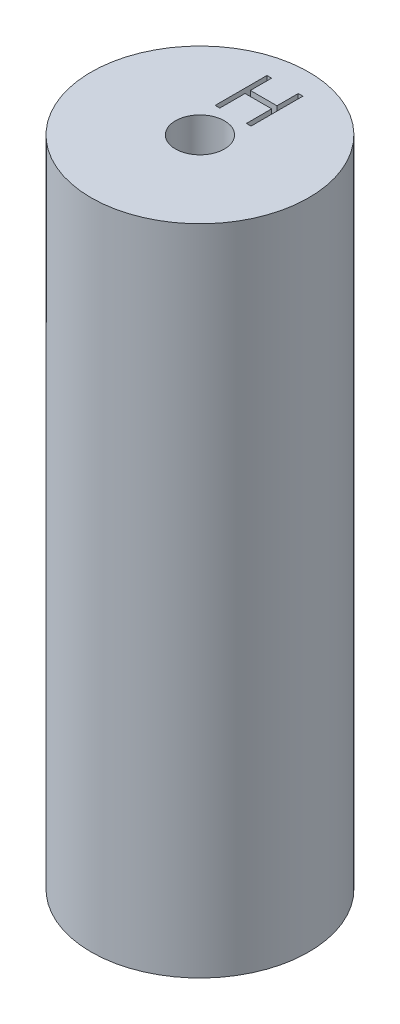
ISO-10303-21;
HEADER;
FILE_DESCRIPTION(('STEP AP214'),'2;1');
FILE_NAME('part.step','',(''),(''),'','','');
FILE_SCHEMA(('AUTOMOTIVE_DESIGN { 1 0 10303 214 1 1 1 1 }'));
ENDSEC;
DATA;
#1=APPLICATION_CONTEXT('core data for automotive mechanical design processes');
#2=APPLICATION_PROTOCOL_DEFINITION('international standard','automotive_design',2000,#1);
#3=PRODUCT_CONTEXT('',#1,'mechanical');
#4=PRODUCT('Part','Part','',(#3));
#5=PRODUCT_RELATED_PRODUCT_CATEGORY('part','',(#4));
#6=PRODUCT_DEFINITION_FORMATION('','',#4);
#7=PRODUCT_DEFINITION_CONTEXT('part definition',#1,'design');
#8=PRODUCT_DEFINITION('design','',#6,#7);
#9=PRODUCT_DEFINITION_SHAPE('','',#8);
#10=(LENGTH_UNIT() NAMED_UNIT(*) SI_UNIT(.MILLI.,.METRE.));
#11=(NAMED_UNIT(*) PLANE_ANGLE_UNIT() SI_UNIT($,.RADIAN.));
#12=(NAMED_UNIT(*) SI_UNIT($,.STERADIAN.) SOLID_ANGLE_UNIT());
#13=UNCERTAINTY_MEASURE_WITH_UNIT(LENGTH_MEASURE(1.E-05),#10,'distance_accuracy_value','');
#14=(GEOMETRIC_REPRESENTATION_CONTEXT(3) GLOBAL_UNCERTAINTY_ASSIGNED_CONTEXT((#13)) GLOBAL_UNIT_ASSIGNED_CONTEXT((#10,
#11,#12)) REPRESENTATION_CONTEXT('',''));
#15=CARTESIAN_POINT('',(0.,0.,0.));
#16=DIRECTION('',(0.,0.,1.));
#17=DIRECTION('',(1.,0.,0.));
#18=AXIS2_PLACEMENT_3D('',#15,#16,#17);
#19=CARTESIAN_POINT('',(0.,60.,0.));
#20=DIRECTION('',(0.,1.,0.));
#21=DIRECTION('',(0.,0.,1.));
#22=AXIS2_PLACEMENT_3D('',#19,#20,#21);
#23=PLANE('',#22);
#24=CARTESIAN_POINT('',(0.,60.,0.));
#25=DIRECTION('',(0.,1.,0.));
#26=DIRECTION('',(0.,0.,1.));
#27=AXIS2_PLACEMENT_3D('',#24,#25,#26);
#28=CIRCLE('',#27,2.25);
#29=CARTESIAN_POINT('',(0.,60.,2.25));
#30=VERTEX_POINT('',#29);
#31=EDGE_CURVE('E354',#30,#30,#28,.T.);
#32=ORIENTED_EDGE('',*,*,#31,.F.);
#33=EDGE_LOOP('',(#32));
#34=FACE_BOUND('',#33,.T.);
#35=CARTESIAN_POINT('',(0.,60.,0.));
#36=DIRECTION('',(0.,1.,0.));
#37=DIRECTION('',(0.,0.,1.));
#38=AXIS2_PLACEMENT_3D('',#35,#36,#37);
#39=CIRCLE('',#38,10.);
#40=CARTESIAN_POINT('',(0.,60.,10.));
#41=VERTEX_POINT('',#40);
#42=EDGE_CURVE('E251',#41,#41,#39,.T.);
#43=ORIENTED_EDGE('',*,*,#42,.T.);
#44=EDGE_LOOP('',(#43));
#45=FACE_BOUND('',#44,.T.);
#46=DIRECTION('',(-1.,0.,0.));
#47=VECTOR('',#46,1.);
#48=CARTESIAN_POINT('',(-1.22115384615385,60.,-3.04447224017773));
#49=LINE('',#48,#47);
#50=CARTESIAN_POINT('',(-1.22115384615385,60.,-3.04447224017773));
#51=VERTEX_POINT('',#50);
#52=CARTESIAN_POINT('',(-1.64855769230769,60.,-3.04447224017773));
#53=VERTEX_POINT('',#52);
#54=EDGE_CURVE('E216',#51,#53,#49,.T.);
#55=ORIENTED_EDGE('',*,*,#54,.T.);
#56=DIRECTION('',(0.,0.,-1.));
#57=VECTOR('',#56,1.);
#58=CARTESIAN_POINT('',(-1.64855769230769,60.,-3.04447224017773));
#59=LINE('',#58,#57);
#60=CARTESIAN_POINT('',(-1.64855769230769,60.,-7.80697224017773));
#61=VERTEX_POINT('',#60);
#62=EDGE_CURVE('E65',#53,#61,#59,.T.);
#63=ORIENTED_EDGE('',*,*,#62,.T.);
#64=DIRECTION('',(1.,0.,0.));
#65=VECTOR('',#64,1.);
#66=CARTESIAN_POINT('',(-1.64855769230769,60.,-7.80697224017773));
#67=LINE('',#66,#65);
#68=CARTESIAN_POINT('',(-1.22115384615385,60.,-7.80697224017773));
#69=VERTEX_POINT('',#68);
#70=EDGE_CURVE('E178',#61,#69,#67,.T.);
#71=ORIENTED_EDGE('',*,*,#70,.T.);
#72=DIRECTION('',(0.,0.,1.));
#73=VECTOR('',#72,1.);
#74=CARTESIAN_POINT('',(-1.22115384615385,60.,-7.80697224017773));
#75=LINE('',#74,#73);
#76=CARTESIAN_POINT('',(-1.22115384615385,60.,-5.85312608633158));
#77=VERTEX_POINT('',#76);
#78=EDGE_CURVE('E183',#69,#77,#75,.T.);
#79=ORIENTED_EDGE('',*,*,#78,.T.);
#80=DIRECTION('',(1.,0.,0.));
#81=VECTOR('',#80,1.);
#82=CARTESIAN_POINT('',(-1.22115384615385,60.,-5.85312608633158));
#83=LINE('',#82,#81);
#84=CARTESIAN_POINT('',(1.22115384615385,60.,-5.85312608633158));
#85=VERTEX_POINT('',#84);
#86=EDGE_CURVE('E187',#77,#85,#83,.T.);
#87=ORIENTED_EDGE('',*,*,#86,.T.);
#88=DIRECTION('',(0.,0.,-1.));
#89=VECTOR('',#88,1.);
#90=CARTESIAN_POINT('',(1.22115384615385,60.,-5.85312608633158));
#91=LINE('',#90,#89);
#92=CARTESIAN_POINT('',(1.22115384615385,60.,-7.80697224017773));
#93=VERTEX_POINT('',#92);
#94=EDGE_CURVE('E191',#85,#93,#91,.T.);
#95=ORIENTED_EDGE('',*,*,#94,.T.);
#96=DIRECTION('',(1.,0.,0.));
#97=VECTOR('',#96,1.);
#98=CARTESIAN_POINT('',(1.22115384615385,60.,-7.80697224017773));
#99=LINE('',#98,#97);
#100=CARTESIAN_POINT('',(1.64855769230769,60.,-7.80697224017773));
#101=VERTEX_POINT('',#100);
#102=EDGE_CURVE('E195',#93,#101,#99,.T.);
#103=ORIENTED_EDGE('',*,*,#102,.T.);
#104=DIRECTION('',(0.,0.,1.));
#105=VECTOR('',#104,1.);
#106=CARTESIAN_POINT('',(1.64855769230769,60.,-7.80697224017773));
#107=LINE('',#106,#105);
#108=CARTESIAN_POINT('',(1.64855769230769,60.,-3.04447224017773));
#109=VERTEX_POINT('',#108);
#110=EDGE_CURVE('E199',#101,#109,#107,.T.);
#111=ORIENTED_EDGE('',*,*,#110,.T.);
#112=DIRECTION('',(-1.,0.,0.));
#113=VECTOR('',#112,1.);
#114=CARTESIAN_POINT('',(1.64855769230769,60.,-3.04447224017773));
#115=LINE('',#114,#113);
#116=CARTESIAN_POINT('',(1.22115384615385,60.,-3.04447224017773));
#117=VERTEX_POINT('',#116);
#118=EDGE_CURVE('E203',#109,#117,#115,.T.);
#119=ORIENTED_EDGE('',*,*,#118,.T.);
#120=DIRECTION('',(0.,0.,-1.));
#121=VECTOR('',#120,1.);
#122=CARTESIAN_POINT('',(1.22115384615385,60.,-3.04447224017773));
#123=LINE('',#122,#121);
#124=CARTESIAN_POINT('',(1.22115384615385,60.,-5.36466454787004));
#125=VERTEX_POINT('',#124);
#126=EDGE_CURVE('E207',#117,#125,#123,.T.);
#127=ORIENTED_EDGE('',*,*,#126,.T.);
#128=DIRECTION('',(-1.,0.,0.));
#129=VECTOR('',#128,1.);
#130=CARTESIAN_POINT('',(1.22115384615385,60.,-5.36466454787004));
#131=LINE('',#130,#129);
#132=CARTESIAN_POINT('',(-1.22115384615385,60.,-5.36466454787004));
#133=VERTEX_POINT('',#132);
#134=EDGE_CURVE('E211',#125,#133,#131,.T.);
#135=ORIENTED_EDGE('',*,*,#134,.T.);
#136=DIRECTION('',(0.,0.,1.));
#137=VECTOR('',#136,1.);
#138=CARTESIAN_POINT('',(-1.22115384615385,60.,-5.36466454787004));
#139=LINE('',#138,#137);
#140=EDGE_CURVE('E164',#133,#51,#139,.T.);
#141=ORIENTED_EDGE('',*,*,#140,.T.);
#142=EDGE_LOOP('',(#55,#63,#71,#79,#87,#95,#103,#111,#119,#127,#135,#141));
#143=FACE_BOUND('',#142,.T.);
#144=ADVANCED_FACE('F48',(#34,#45,#143),#23,.T.);
#145=CARTESIAN_POINT('',(0.,0.,0.));
#146=DIRECTION('',(0.,1.,0.));
#147=DIRECTION('',(0.,0.,1.));
#148=AXIS2_PLACEMENT_3D('',#145,#146,#147);
#149=PLANE('',#148);
#150=CARTESIAN_POINT('',(0.,0.,0.));
#151=DIRECTION('',(0.,1.,0.));
#152=DIRECTION('',(0.,0.,1.));
#153=AXIS2_PLACEMENT_3D('',#150,#151,#152);
#154=CIRCLE('',#153,10.);
#155=CARTESIAN_POINT('',(0.,0.,10.));
#156=VERTEX_POINT('',#155);
#157=EDGE_CURVE('E263',#156,#156,#154,.T.);
#158=ORIENTED_EDGE('',*,*,#157,.F.);
#159=EDGE_LOOP('',(#158));
#160=FACE_BOUND('',#159,.T.);
#161=ADVANCED_FACE('F272',(#160),#149,.F.);
#162=CARTESIAN_POINT('',(0.,4.,0.));
#163=DIRECTION('',(0.,-1.,0.));
#164=DIRECTION('',(0.,0.,-1.));
#165=AXIS2_PLACEMENT_3D('',#162,#163,#164);
#166=CYLINDRICAL_SURFACE('',#165,10.);
#167=ORIENTED_EDGE('',*,*,#157,.T.);
#168=EDGE_LOOP('',(#167));
#169=FACE_BOUND('',#168,.T.);
#170=ORIENTED_EDGE('',*,*,#42,.F.);
#171=EDGE_LOOP('',(#170));
#172=FACE_BOUND('',#171,.T.);
#173=ADVANCED_FACE('F50',(#169,#172),#166,.T.);
#174=CARTESIAN_POINT('',(-1.64855769230769,58.,-3.04447224017773));
#175=DIRECTION('',(1.,0.,0.));
#176=DIRECTION('',(0.,0.,-1.));
#177=AXIS2_PLACEMENT_3D('',#174,#175,#176);
#178=PLANE('',#177);
#179=ORIENTED_EDGE('',*,*,#62,.F.);
#180=DIRECTION('',(0.,1.,0.));
#181=VECTOR('',#180,1.);
#182=CARTESIAN_POINT('',(-1.64855769230769,58.,-3.04447224017773));
#183=LINE('',#182,#181);
#184=CARTESIAN_POINT('',(-1.64855769230769,58.,-3.04447224017773));
#185=VERTEX_POINT('',#184);
#186=EDGE_CURVE('E172',#185,#53,#183,.T.);
#187=ORIENTED_EDGE('',*,*,#186,.F.);
#188=DIRECTION('',(0.,0.,-1.));
#189=VECTOR('',#188,1.);
#190=CARTESIAN_POINT('',(-1.64855769230769,58.,-3.04447224017773));
#191=LINE('',#190,#189);
#192=CARTESIAN_POINT('',(-1.64855769230769,58.,-7.80697224017773));
#193=VERTEX_POINT('',#192);
#194=EDGE_CURVE('E220',#185,#193,#191,.T.);
#195=ORIENTED_EDGE('',*,*,#194,.T.);
#196=DIRECTION('',(0.,1.,0.));
#197=VECTOR('',#196,1.);
#198=CARTESIAN_POINT('',(-1.64855769230769,58.,-7.80697224017773));
#199=LINE('',#198,#197);
#200=EDGE_CURVE('E248',#193,#61,#199,.T.);
#201=ORIENTED_EDGE('',*,*,#200,.T.);
#202=EDGE_LOOP('',(#179,#187,#195,#201));
#203=FACE_BOUND('',#202,.T.);
#204=ADVANCED_FACE('F278',(#203),#178,.T.);
#205=CARTESIAN_POINT('',(-1.64855769230769,58.,-7.80697224017773));
#206=DIRECTION('',(0.,0.,1.));
#207=DIRECTION('',(1.,0.,0.));
#208=AXIS2_PLACEMENT_3D('',#205,#206,#207);
#209=PLANE('',#208);
#210=ORIENTED_EDGE('',*,*,#70,.F.);
#211=ORIENTED_EDGE('',*,*,#200,.F.);
#212=DIRECTION('',(1.,0.,0.));
#213=VECTOR('',#212,1.);
#214=CARTESIAN_POINT('',(-1.64855769230769,58.,-7.80697224017773));
#215=LINE('',#214,#213);
#216=CARTESIAN_POINT('',(-1.22115384615385,58.,-7.80697224017773));
#217=VERTEX_POINT('',#216);
#218=EDGE_CURVE('E122',#193,#217,#215,.T.);
#219=ORIENTED_EDGE('',*,*,#218,.T.);
#220=DIRECTION('',(0.,1.,0.));
#221=VECTOR('',#220,1.);
#222=CARTESIAN_POINT('',(-1.22115384615385,58.,-7.80697224017773));
#223=LINE('',#222,#221);
#224=EDGE_CURVE('E245',#217,#69,#223,.T.);
#225=ORIENTED_EDGE('',*,*,#224,.T.);
#226=EDGE_LOOP('',(#210,#211,#219,#225));
#227=FACE_BOUND('',#226,.T.);
#228=ADVANCED_FACE('F301',(#227),#209,.T.);
#229=CARTESIAN_POINT('',(-1.22115384615385,58.,-7.80697224017773));
#230=DIRECTION('',(-1.,0.,0.));
#231=DIRECTION('',(0.,0.,1.));
#232=AXIS2_PLACEMENT_3D('',#229,#230,#231);
#233=PLANE('',#232);
#234=ORIENTED_EDGE('',*,*,#78,.F.);
#235=ORIENTED_EDGE('',*,*,#224,.F.);
#236=DIRECTION('',(0.,0.,1.));
#237=VECTOR('',#236,1.);
#238=CARTESIAN_POINT('',(-1.22115384615385,58.,-7.80697224017773));
#239=LINE('',#238,#237);
#240=CARTESIAN_POINT('',(-1.22115384615385,58.,-5.85312608633158));
#241=VERTEX_POINT('',#240);
#242=EDGE_CURVE('E364',#217,#241,#239,.T.);
#243=ORIENTED_EDGE('',*,*,#242,.T.);
#244=DIRECTION('',(0.,1.,0.));
#245=VECTOR('',#244,1.);
#246=CARTESIAN_POINT('',(-1.22115384615385,58.,-5.85312608633158));
#247=LINE('',#246,#245);
#248=EDGE_CURVE('E242',#241,#77,#247,.T.);
#249=ORIENTED_EDGE('',*,*,#248,.T.);
#250=EDGE_LOOP('',(#234,#235,#243,#249));
#251=FACE_BOUND('',#250,.T.);
#252=ADVANCED_FACE('F304',(#251),#233,.T.);
#253=CARTESIAN_POINT('',(-1.22115384615385,58.,-5.85312608633158));
#254=DIRECTION('',(0.,0.,1.));
#255=DIRECTION('',(1.,0.,0.));
#256=AXIS2_PLACEMENT_3D('',#253,#254,#255);
#257=PLANE('',#256);
#258=ORIENTED_EDGE('',*,*,#86,.F.);
#259=ORIENTED_EDGE('',*,*,#248,.F.);
#260=DIRECTION('',(1.,0.,0.));
#261=VECTOR('',#260,1.);
#262=CARTESIAN_POINT('',(-1.22115384615385,58.,-5.85312608633158));
#263=LINE('',#262,#261);
#264=CARTESIAN_POINT('',(1.22115384615385,58.,-5.85312608633158));
#265=VERTEX_POINT('',#264);
#266=EDGE_CURVE('E367',#241,#265,#263,.T.);
#267=ORIENTED_EDGE('',*,*,#266,.T.);
#268=DIRECTION('',(0.,1.,0.));
#269=VECTOR('',#268,1.);
#270=CARTESIAN_POINT('',(1.22115384615385,58.,-5.85312608633158));
#271=LINE('',#270,#269);
#272=EDGE_CURVE('E239',#265,#85,#271,.T.);
#273=ORIENTED_EDGE('',*,*,#272,.T.);
#274=EDGE_LOOP('',(#258,#259,#267,#273));
#275=FACE_BOUND('',#274,.T.);
#276=ADVANCED_FACE('F308',(#275),#257,.T.);
#277=CARTESIAN_POINT('',(1.22115384615385,58.,-5.85312608633158));
#278=DIRECTION('',(1.,0.,0.));
#279=DIRECTION('',(0.,0.,-1.));
#280=AXIS2_PLACEMENT_3D('',#277,#278,#279);
#281=PLANE('',#280);
#282=ORIENTED_EDGE('',*,*,#94,.F.);
#283=ORIENTED_EDGE('',*,*,#272,.F.);
#284=DIRECTION('',(0.,0.,-1.));
#285=VECTOR('',#284,1.);
#286=CARTESIAN_POINT('',(1.22115384615385,58.,-5.85312608633158));
#287=LINE('',#286,#285);
#288=CARTESIAN_POINT('',(1.22115384615385,58.,-7.80697224017773));
#289=VERTEX_POINT('',#288);
#290=EDGE_CURVE('E370',#265,#289,#287,.T.);
#291=ORIENTED_EDGE('',*,*,#290,.T.);
#292=DIRECTION('',(0.,1.,0.));
#293=VECTOR('',#292,1.);
#294=CARTESIAN_POINT('',(1.22115384615385,58.,-7.80697224017773));
#295=LINE('',#294,#293);
#296=EDGE_CURVE('E236',#289,#93,#295,.T.);
#297=ORIENTED_EDGE('',*,*,#296,.T.);
#298=EDGE_LOOP('',(#282,#283,#291,#297));
#299=FACE_BOUND('',#298,.T.);
#300=ADVANCED_FACE('F312',(#299),#281,.T.);
#301=CARTESIAN_POINT('',(1.22115384615385,58.,-7.80697224017773));
#302=DIRECTION('',(0.,0.,1.));
#303=DIRECTION('',(1.,0.,0.));
#304=AXIS2_PLACEMENT_3D('',#301,#302,#303);
#305=PLANE('',#304);
#306=ORIENTED_EDGE('',*,*,#102,.F.);
#307=ORIENTED_EDGE('',*,*,#296,.F.);
#308=DIRECTION('',(1.,0.,0.));
#309=VECTOR('',#308,1.);
#310=CARTESIAN_POINT('',(1.22115384615385,58.,-7.80697224017773));
#311=LINE('',#310,#309);
#312=CARTESIAN_POINT('',(1.64855769230769,58.,-7.80697224017773));
#313=VERTEX_POINT('',#312);
#314=EDGE_CURVE('E373',#289,#313,#311,.T.);
#315=ORIENTED_EDGE('',*,*,#314,.T.);
#316=DIRECTION('',(0.,1.,0.));
#317=VECTOR('',#316,1.);
#318=CARTESIAN_POINT('',(1.64855769230769,58.,-7.80697224017773));
#319=LINE('',#318,#317);
#320=EDGE_CURVE('E233',#313,#101,#319,.T.);
#321=ORIENTED_EDGE('',*,*,#320,.T.);
#322=EDGE_LOOP('',(#306,#307,#315,#321));
#323=FACE_BOUND('',#322,.T.);
#324=ADVANCED_FACE('F316',(#323),#305,.T.);
#325=CARTESIAN_POINT('',(1.64855769230769,58.,-7.80697224017773));
#326=DIRECTION('',(-1.,0.,0.));
#327=DIRECTION('',(0.,0.,1.));
#328=AXIS2_PLACEMENT_3D('',#325,#326,#327);
#329=PLANE('',#328);
#330=ORIENTED_EDGE('',*,*,#110,.F.);
#331=ORIENTED_EDGE('',*,*,#320,.F.);
#332=DIRECTION('',(0.,0.,1.));
#333=VECTOR('',#332,1.);
#334=CARTESIAN_POINT('',(1.64855769230769,58.,-7.80697224017773));
#335=LINE('',#334,#333);
#336=CARTESIAN_POINT('',(1.64855769230769,58.,-3.04447224017773));
#337=VERTEX_POINT('',#336);
#338=EDGE_CURVE('E376',#313,#337,#335,.T.);
#339=ORIENTED_EDGE('',*,*,#338,.T.);
#340=DIRECTION('',(0.,1.,0.));
#341=VECTOR('',#340,1.);
#342=CARTESIAN_POINT('',(1.64855769230769,58.,-3.04447224017773));
#343=LINE('',#342,#341);
#344=EDGE_CURVE('E230',#337,#109,#343,.T.);
#345=ORIENTED_EDGE('',*,*,#344,.T.);
#346=EDGE_LOOP('',(#330,#331,#339,#345));
#347=FACE_BOUND('',#346,.T.);
#348=ADVANCED_FACE('F320',(#347),#329,.T.);
#349=CARTESIAN_POINT('',(1.64855769230769,58.,-3.04447224017773));
#350=DIRECTION('',(0.,0.,-1.));
#351=DIRECTION('',(-1.,0.,0.));
#352=AXIS2_PLACEMENT_3D('',#349,#350,#351);
#353=PLANE('',#352);
#354=ORIENTED_EDGE('',*,*,#118,.F.);
#355=ORIENTED_EDGE('',*,*,#344,.F.);
#356=DIRECTION('',(-1.,0.,0.));
#357=VECTOR('',#356,1.);
#358=CARTESIAN_POINT('',(1.64855769230769,58.,-3.04447224017773));
#359=LINE('',#358,#357);
#360=CARTESIAN_POINT('',(1.22115384615385,58.,-3.04447224017773));
#361=VERTEX_POINT('',#360);
#362=EDGE_CURVE('E379',#337,#361,#359,.T.);
#363=ORIENTED_EDGE('',*,*,#362,.T.);
#364=DIRECTION('',(0.,1.,0.));
#365=VECTOR('',#364,1.);
#366=CARTESIAN_POINT('',(1.22115384615385,58.,-3.04447224017773));
#367=LINE('',#366,#365);
#368=EDGE_CURVE('E227',#361,#117,#367,.T.);
#369=ORIENTED_EDGE('',*,*,#368,.T.);
#370=EDGE_LOOP('',(#354,#355,#363,#369));
#371=FACE_BOUND('',#370,.T.);
#372=ADVANCED_FACE('F324',(#371),#353,.T.);
#373=CARTESIAN_POINT('',(1.22115384615385,58.,-3.04447224017773));
#374=DIRECTION('',(1.,0.,0.));
#375=DIRECTION('',(0.,0.,-1.));
#376=AXIS2_PLACEMENT_3D('',#373,#374,#375);
#377=PLANE('',#376);
#378=ORIENTED_EDGE('',*,*,#126,.F.);
#379=ORIENTED_EDGE('',*,*,#368,.F.);
#380=DIRECTION('',(0.,0.,-1.));
#381=VECTOR('',#380,1.);
#382=CARTESIAN_POINT('',(1.22115384615385,58.,-3.04447224017773));
#383=LINE('',#382,#381);
#384=CARTESIAN_POINT('',(1.22115384615385,58.,-5.36466454787004));
#385=VERTEX_POINT('',#384);
#386=EDGE_CURVE('E160',#361,#385,#383,.T.);
#387=ORIENTED_EDGE('',*,*,#386,.T.);
#388=DIRECTION('',(0.,1.,0.));
#389=VECTOR('',#388,1.);
#390=CARTESIAN_POINT('',(1.22115384615385,58.,-5.36466454787004));
#391=LINE('',#390,#389);
#392=EDGE_CURVE('E155',#385,#125,#391,.T.);
#393=ORIENTED_EDGE('',*,*,#392,.T.);
#394=EDGE_LOOP('',(#378,#379,#387,#393));
#395=FACE_BOUND('',#394,.T.);
#396=ADVANCED_FACE('F328',(#395),#377,.T.);
#397=CARTESIAN_POINT('',(1.22115384615385,58.,-5.36466454787004));
#398=DIRECTION('',(0.,0.,-1.));
#399=DIRECTION('',(-1.,0.,0.));
#400=AXIS2_PLACEMENT_3D('',#397,#398,#399);
#401=PLANE('',#400);
#402=ORIENTED_EDGE('',*,*,#134,.F.);
#403=ORIENTED_EDGE('',*,*,#392,.F.);
#404=DIRECTION('',(-1.,0.,0.));
#405=VECTOR('',#404,1.);
#406=CARTESIAN_POINT('',(1.22115384615385,58.,-5.36466454787004));
#407=LINE('',#406,#405);
#408=CARTESIAN_POINT('',(-1.22115384615385,58.,-5.36466454787004));
#409=VERTEX_POINT('',#408);
#410=EDGE_CURVE('E150',#385,#409,#407,.T.);
#411=ORIENTED_EDGE('',*,*,#410,.T.);
#412=DIRECTION('',(0.,1.,0.));
#413=VECTOR('',#412,1.);
#414=CARTESIAN_POINT('',(-1.22115384615385,58.,-5.36466454787004));
#415=LINE('',#414,#413);
#416=EDGE_CURVE('E154',#409,#133,#415,.T.);
#417=ORIENTED_EDGE('',*,*,#416,.T.);
#418=EDGE_LOOP('',(#402,#403,#411,#417));
#419=FACE_BOUND('',#418,.T.);
#420=ADVANCED_FACE('F153',(#419),#401,.T.);
#421=CARTESIAN_POINT('',(-1.22115384615385,58.,-5.36466454787004));
#422=DIRECTION('',(-1.,0.,0.));
#423=DIRECTION('',(0.,0.,1.));
#424=AXIS2_PLACEMENT_3D('',#421,#422,#423);
#425=PLANE('',#424);
#426=ORIENTED_EDGE('',*,*,#140,.F.);
#427=ORIENTED_EDGE('',*,*,#416,.F.);
#428=DIRECTION('',(0.,0.,1.));
#429=VECTOR('',#428,1.);
#430=CARTESIAN_POINT('',(-1.22115384615385,58.,-5.36466454787004));
#431=LINE('',#430,#429);
#432=CARTESIAN_POINT('',(-1.22115384615385,58.,-3.04447224017773));
#433=VERTEX_POINT('',#432);
#434=EDGE_CURVE('E159',#409,#433,#431,.T.);
#435=ORIENTED_EDGE('',*,*,#434,.T.);
#436=DIRECTION('',(0.,1.,0.));
#437=VECTOR('',#436,1.);
#438=CARTESIAN_POINT('',(-1.22115384615385,58.,-3.04447224017773));
#439=LINE('',#438,#437);
#440=EDGE_CURVE('E113',#433,#51,#439,.T.);
#441=ORIENTED_EDGE('',*,*,#440,.T.);
#442=EDGE_LOOP('',(#426,#427,#435,#441));
#443=FACE_BOUND('',#442,.T.);
#444=ADVANCED_FACE('F162',(#443),#425,.T.);
#445=CARTESIAN_POINT('',(-1.22115384615385,58.,-3.04447224017773));
#446=DIRECTION('',(0.,0.,-1.));
#447=DIRECTION('',(-1.,0.,0.));
#448=AXIS2_PLACEMENT_3D('',#445,#446,#447);
#449=PLANE('',#448);
#450=ORIENTED_EDGE('',*,*,#54,.F.);
#451=ORIENTED_EDGE('',*,*,#440,.F.);
#452=DIRECTION('',(-1.,0.,0.));
#453=VECTOR('',#452,1.);
#454=CARTESIAN_POINT('',(-1.22115384615385,58.,-3.04447224017773));
#455=LINE('',#454,#453);
#456=EDGE_CURVE('E73',#433,#185,#455,.T.);
#457=ORIENTED_EDGE('',*,*,#456,.T.);
#458=ORIENTED_EDGE('',*,*,#186,.T.);
#459=EDGE_LOOP('',(#450,#451,#457,#458));
#460=FACE_BOUND('',#459,.T.);
#461=ADVANCED_FACE('F337',(#460),#449,.T.);
#462=CARTESIAN_POINT('',(0.,58.,0.));
#463=DIRECTION('',(0.,-1.,0.));
#464=DIRECTION('',(0.,0.,-1.));
#465=AXIS2_PLACEMENT_3D('',#462,#463,#464);
#466=PLANE('',#465);
#467=ORIENTED_EDGE('',*,*,#194,.F.);
#468=ORIENTED_EDGE('',*,*,#456,.F.);
#469=ORIENTED_EDGE('',*,*,#434,.F.);
#470=ORIENTED_EDGE('',*,*,#410,.F.);
#471=ORIENTED_EDGE('',*,*,#386,.F.);
#472=ORIENTED_EDGE('',*,*,#362,.F.);
#473=ORIENTED_EDGE('',*,*,#338,.F.);
#474=ORIENTED_EDGE('',*,*,#314,.F.);
#475=ORIENTED_EDGE('',*,*,#290,.F.);
#476=ORIENTED_EDGE('',*,*,#266,.F.);
#477=ORIENTED_EDGE('',*,*,#242,.F.);
#478=ORIENTED_EDGE('',*,*,#218,.F.);
#479=EDGE_LOOP('',(#467,#468,#469,#470,#471,#472,#473,#474,#475,#476,#477,#478));
#480=FACE_BOUND('',#479,.T.);
#481=ADVANCED_FACE('F168',(#480),#466,.F.);
#482=CARTESIAN_POINT('',(0.,9.99999999999999,0.));
#483=DIRECTION('',(0.,1.,0.));
#484=DIRECTION('',(0.,0.,1.));
#485=AXIS2_PLACEMENT_3D('',#482,#483,#484);
#486=CYLINDRICAL_SURFACE('',#485,2.25);
#487=CARTESIAN_POINT('',(0.,9.99999999999999,0.));
#488=DIRECTION('',(0.,1.,0.));
#489=DIRECTION('',(0.,0.,1.));
#490=AXIS2_PLACEMENT_3D('',#487,#488,#489);
#491=CIRCLE('',#490,2.25);
#492=CARTESIAN_POINT('',(0.,9.99999999999999,2.25));
#493=VERTEX_POINT('',#492);
#494=EDGE_CURVE('E179',#493,#493,#491,.T.);
#495=ORIENTED_EDGE('',*,*,#494,.F.);
#496=EDGE_LOOP('',(#495));
#497=FACE_BOUND('',#496,.T.);
#498=ORIENTED_EDGE('',*,*,#31,.T.);
#499=EDGE_LOOP('',(#498));
#500=FACE_BOUND('',#499,.T.);
#501=ADVANCED_FACE('F342',(#497,#500),#486,.F.);
#502=CARTESIAN_POINT('',(0.,9.99999999999999,0.));
#503=DIRECTION('',(0.,1.,0.));
#504=DIRECTION('',(0.,0.,1.));
#505=AXIS2_PLACEMENT_3D('',#502,#503,#504);
#506=PLANE('',#505);
#507=ORIENTED_EDGE('',*,*,#494,.T.);
#508=EDGE_LOOP('',(#507));
#509=FACE_BOUND('',#508,.T.);
#510=ADVANCED_FACE('F345',(#509),#506,.T.);
#511=CLOSED_SHELL('',(#144,#161,#173,#204,#228,#252,#276,#300,#324,#348,#372,#396,#420,#444,
#461,#481,#501,#510));
#512=CARTESIAN_POINT('',(0.,56.,0.));
#513=DIRECTION('',(0.,-1.,0.));
#514=DIRECTION('',(0.,0.,-1.));
#515=AXIS2_PLACEMENT_3D('',#512,#513,#514);
#516=CYLINDRICAL_SURFACE('',#515,3.5);
#517=CARTESIAN_POINT('',(0.,56.,0.));
#518=DIRECTION('',(0.,1.,0.));
#519=DIRECTION('',(0.,0.,1.));
#520=AXIS2_PLACEMENT_3D('',#517,#518,#519);
#521=CIRCLE('',#520,3.5);
#522=CARTESIAN_POINT('',(0.,56.,-3.5));
#523=VERTEX_POINT('',#522);
#524=EDGE_CURVE('E259',#523,#523,#521,.T.);
#525=CARTESIAN_POINT('',(0.,4.,0.));
#526=DIRECTION('',(0.,1.,0.));
#527=DIRECTION('',(0.,0.,1.));
#528=AXIS2_PLACEMENT_3D('',#525,#526,#527);
#529=CIRCLE('',#528,3.5);
#530=CARTESIAN_POINT('',(0.,4.,-3.5));
#531=VERTEX_POINT('',#530);
#532=EDGE_CURVE('E58',#531,#531,#529,.T.);
#533=CARTESIAN_POINT('',(0.,56.,-3.5));
#534=CARTESIAN_POINT('',(0.,55.4583333333333,-3.5));
#535=CARTESIAN_POINT('',(0.,54.9166666666667,-3.5));
#536=CARTESIAN_POINT('',(0.,53.8333333333333,-3.5));
#537=CARTESIAN_POINT('',(0.,53.2916666666667,-3.5));
#538=CARTESIAN_POINT('',(0.,52.2083333333333,-3.5));
#539=CARTESIAN_POINT('',(0.,51.6666666666667,-3.5));
#540=CARTESIAN_POINT('',(0.,50.5833333333333,-3.5));
#541=CARTESIAN_POINT('',(0.,50.0416666666667,-3.5));
#542=CARTESIAN_POINT('',(0.,48.9583333333333,-3.5));
#543=CARTESIAN_POINT('',(0.,48.4166666666667,-3.5));
#544=CARTESIAN_POINT('',(0.,47.3333333333333,-3.5));
#545=CARTESIAN_POINT('',(0.,46.7916666666667,-3.5));
#546=CARTESIAN_POINT('',(0.,45.7083333333333,-3.5));
#547=CARTESIAN_POINT('',(0.,45.1666666666667,-3.5));
#548=CARTESIAN_POINT('',(0.,44.0833333333333,-3.5));
#549=CARTESIAN_POINT('',(0.,43.5416666666667,-3.5));
#550=CARTESIAN_POINT('',(0.,42.4583333333333,-3.5));
#551=CARTESIAN_POINT('',(0.,41.9166666666667,-3.5));
#552=CARTESIAN_POINT('',(0.,40.8333333333333,-3.5));
#553=CARTESIAN_POINT('',(0.,40.2916666666667,-3.5));
#554=CARTESIAN_POINT('',(0.,39.2083333333333,-3.5));
#555=CARTESIAN_POINT('',(0.,38.6666666666667,-3.5));
#556=CARTESIAN_POINT('',(0.,37.5833333333333,-3.5));
#557=CARTESIAN_POINT('',(0.,37.0416666666667,-3.5));
#558=CARTESIAN_POINT('',(0.,35.9583333333333,-3.5));
#559=CARTESIAN_POINT('',(0.,35.4166666666667,-3.5));
#560=CARTESIAN_POINT('',(0.,34.3333333333333,-3.5));
#561=CARTESIAN_POINT('',(0.,33.7916666666667,-3.5));
#562=CARTESIAN_POINT('',(0.,32.7083333333333,-3.5));
#563=CARTESIAN_POINT('',(0.,32.1666666666667,-3.5));
#564=CARTESIAN_POINT('',(0.,31.0833333333333,-3.5));
#565=CARTESIAN_POINT('',(0.,30.5416666666667,-3.5));
#566=CARTESIAN_POINT('',(0.,29.4583333333333,-3.5));
#567=CARTESIAN_POINT('',(0.,28.9166666666667,-3.5));
#568=CARTESIAN_POINT('',(0.,27.8333333333333,-3.5));
#569=CARTESIAN_POINT('',(0.,27.2916666666667,-3.5));
#570=CARTESIAN_POINT('',(0.,26.2083333333333,-3.5));
#571=CARTESIAN_POINT('',(0.,25.6666666666667,-3.5));
#572=CARTESIAN_POINT('',(0.,24.5833333333333,-3.5));
#573=CARTESIAN_POINT('',(0.,24.0416666666667,-3.5));
#574=CARTESIAN_POINT('',(0.,22.9583333333333,-3.5));
#575=CARTESIAN_POINT('',(0.,22.4166666666667,-3.5));
#576=CARTESIAN_POINT('',(0.,21.3333333333333,-3.5));
#577=CARTESIAN_POINT('',(0.,20.7916666666667,-3.5));
#578=CARTESIAN_POINT('',(0.,19.7083333333333,-3.5));
#579=CARTESIAN_POINT('',(0.,19.1666666666667,-3.5));
#580=CARTESIAN_POINT('',(0.,18.0833333333333,-3.5));
#581=CARTESIAN_POINT('',(0.,17.5416666666667,-3.5));
#582=CARTESIAN_POINT('',(0.,16.4583333333333,-3.5));
#583=CARTESIAN_POINT('',(0.,15.9166666666667,-3.5));
#584=CARTESIAN_POINT('',(0.,14.8333333333333,-3.5));
#585=CARTESIAN_POINT('',(0.,14.2916666666667,-3.5));
#586=CARTESIAN_POINT('',(0.,13.2083333333333,-3.5));
#587=CARTESIAN_POINT('',(0.,12.6666666666667,-3.5));
#588=CARTESIAN_POINT('',(0.,11.5833333333333,-3.5));
#589=CARTESIAN_POINT('',(0.,11.0416666666667,-3.5));
#590=CARTESIAN_POINT('',(0.,9.95833333333333,-3.5));
#591=CARTESIAN_POINT('',(0.,9.41666666666666,-3.5));
#592=CARTESIAN_POINT('',(0.,8.33333333333333,-3.5));
#593=CARTESIAN_POINT('',(0.,7.79166666666666,-3.5));
#594=CARTESIAN_POINT('',(0.,6.70833333333333,-3.5));
#595=CARTESIAN_POINT('',(0.,6.16666666666667,-3.5));
#596=CARTESIAN_POINT('',(0.,5.08333333333333,-3.5));
#597=CARTESIAN_POINT('',(0.,4.54166666666666,-3.5));
#598=CARTESIAN_POINT('',(0.,4.,-3.5));
#599=B_SPLINE_CURVE_WITH_KNOTS('',3,(#533,#534,#535,#536,#537,#538,#539,#540,#541,#542,#543,
#544,#545,#546,#547,#548,#549,#550,#551,#552,#553,#554,#555,#556,#557,#558,#559,#560,#561,#562,
#563,#564,#565,#566,#567,#568,#569,#570,#571,#572,#573,#574,#575,#576,#577,#578,#579,#580,#581,
#582,#583,#584,#585,#586,#587,#588,#589,#590,#591,#592,#593,#594,#595,#596,#597,#598),
.UNSPECIFIED.,.F.,.F.,(4,2,2,2,2,2,2,2,2,2,2,2,2,2,2,2,2,2,2,2,2,2,2,2,2,2,2,2,2,2,2,2,4),(0.,
1.62499999999999,3.25,4.875,6.5,8.12499999999999,9.74999999999999,11.375,13.,14.625,16.25,
17.875,19.5,21.125,22.75,24.375,26.,27.625,29.25,30.875,32.5,34.125,35.75,37.375,39.,40.625,
42.25,43.875,45.5,47.125,48.75,50.375,52.),.UNSPECIFIED.);
#600=EDGE_CURVE('BSEAM286',#523,#531,#599,.T.);
#601=ORIENTED_EDGE('',*,*,#524,.F.);
#602=ORIENTED_EDGE('',*,*,#532,.T.);
#603=ORIENTED_EDGE('',*,*,#600,.T.);
#604=ORIENTED_EDGE('',*,*,#600,.F.);
#605=EDGE_LOOP('',(#601,#603,#602,#604));
#606=FACE_BOUND('',#605,.T.);
#607=ADVANCED_FACE('F286',(#606),#516,.T.);
#608=CARTESIAN_POINT('',(0.,4.,0.));
#609=DIRECTION('',(0.,1.,0.));
#610=DIRECTION('',(0.,0.,1.));
#611=AXIS2_PLACEMENT_3D('',#608,#609,#610);
#612=PLANE('',#611);
#613=CARTESIAN_POINT('',(0.,4.,0.));
#614=DIRECTION('',(0.,1.,0.));
#615=DIRECTION('',(0.,0.,1.));
#616=AXIS2_PLACEMENT_3D('',#613,#614,#615);
#617=CIRCLE('',#616,8.);
#618=CARTESIAN_POINT('',(0.,4.,-8.));
#619=VERTEX_POINT('',#618);
#620=EDGE_CURVE('E12',#619,#619,#617,.F.);
#621=ORIENTED_EDGE('',*,*,#620,.F.);
#622=EDGE_LOOP('',(#621));
#623=FACE_BOUND('',#622,.T.);
#624=ORIENTED_EDGE('',*,*,#532,.F.);
#625=EDGE_LOOP('',(#624));
#626=FACE_BOUND('',#625,.T.);
#627=ADVANCED_FACE('F282',(#623,#626),#612,.T.);
#628=CARTESIAN_POINT('',(0.,56.,0.));
#629=DIRECTION('',(0.,-1.,0.));
#630=DIRECTION('',(0.,0.,-1.));
#631=AXIS2_PLACEMENT_3D('',#628,#629,#630);
#632=CYLINDRICAL_SURFACE('',#631,8.);
#633=CARTESIAN_POINT('',(0.,56.,0.));
#634=DIRECTION('',(0.,1.,0.));
#635=DIRECTION('',(0.,0.,1.));
#636=AXIS2_PLACEMENT_3D('',#633,#634,#635);
#637=CIRCLE('',#636,8.);
#638=CARTESIAN_POINT('',(0.,56.,-8.));
#639=VERTEX_POINT('',#638);
#640=EDGE_CURVE('E255',#639,#639,#637,.T.);
#641=CARTESIAN_POINT('',(0.,56.,-8.));
#642=CARTESIAN_POINT('',(0.,55.4583333333333,-8.));
#643=CARTESIAN_POINT('',(0.,54.9166666666667,-8.));
#644=CARTESIAN_POINT('',(0.,53.8333333333333,-8.));
#645=CARTESIAN_POINT('',(0.,53.2916666666667,-8.));
#646=CARTESIAN_POINT('',(0.,52.2083333333333,-8.));
#647=CARTESIAN_POINT('',(0.,51.6666666666667,-8.));
#648=CARTESIAN_POINT('',(0.,50.5833333333333,-8.));
#649=CARTESIAN_POINT('',(0.,50.0416666666667,-8.));
#650=CARTESIAN_POINT('',(0.,48.9583333333333,-8.));
#651=CARTESIAN_POINT('',(0.,48.4166666666667,-8.));
#652=CARTESIAN_POINT('',(0.,47.3333333333333,-8.));
#653=CARTESIAN_POINT('',(0.,46.7916666666667,-8.));
#654=CARTESIAN_POINT('',(0.,45.7083333333333,-8.));
#655=CARTESIAN_POINT('',(0.,45.1666666666667,-8.));
#656=CARTESIAN_POINT('',(0.,44.0833333333333,-8.));
#657=CARTESIAN_POINT('',(0.,43.5416666666667,-8.));
#658=CARTESIAN_POINT('',(0.,42.4583333333333,-8.));
#659=CARTESIAN_POINT('',(0.,41.9166666666667,-8.));
#660=CARTESIAN_POINT('',(0.,40.8333333333333,-8.));
#661=CARTESIAN_POINT('',(0.,40.2916666666667,-8.));
#662=CARTESIAN_POINT('',(0.,39.2083333333333,-8.));
#663=CARTESIAN_POINT('',(0.,38.6666666666667,-8.));
#664=CARTESIAN_POINT('',(0.,37.5833333333333,-8.));
#665=CARTESIAN_POINT('',(0.,37.0416666666667,-8.));
#666=CARTESIAN_POINT('',(0.,35.9583333333333,-8.));
#667=CARTESIAN_POINT('',(0.,35.4166666666667,-8.));
#668=CARTESIAN_POINT('',(0.,34.3333333333333,-8.));
#669=CARTESIAN_POINT('',(0.,33.7916666666667,-8.));
#670=CARTESIAN_POINT('',(0.,32.7083333333333,-8.));
#671=CARTESIAN_POINT('',(0.,32.1666666666667,-8.));
#672=CARTESIAN_POINT('',(0.,31.0833333333333,-8.));
#673=CARTESIAN_POINT('',(0.,30.5416666666667,-8.));
#674=CARTESIAN_POINT('',(0.,29.4583333333333,-8.));
#675=CARTESIAN_POINT('',(0.,28.9166666666667,-8.));
#676=CARTESIAN_POINT('',(0.,27.8333333333333,-8.));
#677=CARTESIAN_POINT('',(0.,27.2916666666667,-8.));
#678=CARTESIAN_POINT('',(0.,26.2083333333333,-8.));
#679=CARTESIAN_POINT('',(0.,25.6666666666667,-8.));
#680=CARTESIAN_POINT('',(0.,24.5833333333333,-8.));
#681=CARTESIAN_POINT('',(0.,24.0416666666667,-8.));
#682=CARTESIAN_POINT('',(0.,22.9583333333333,-8.));
#683=CARTESIAN_POINT('',(0.,22.4166666666667,-8.));
#684=CARTESIAN_POINT('',(0.,21.3333333333333,-8.));
#685=CARTESIAN_POINT('',(0.,20.7916666666667,-8.));
#686=CARTESIAN_POINT('',(0.,19.7083333333333,-8.));
#687=CARTESIAN_POINT('',(0.,19.1666666666667,-8.));
#688=CARTESIAN_POINT('',(0.,18.0833333333333,-8.));
#689=CARTESIAN_POINT('',(0.,17.5416666666667,-8.));
#690=CARTESIAN_POINT('',(0.,16.4583333333333,-8.));
#691=CARTESIAN_POINT('',(0.,15.9166666666667,-8.));
#692=CARTESIAN_POINT('',(0.,14.8333333333333,-8.));
#693=CARTESIAN_POINT('',(0.,14.2916666666667,-8.));
#694=CARTESIAN_POINT('',(0.,13.2083333333333,-8.));
#695=CARTESIAN_POINT('',(0.,12.6666666666667,-8.));
#696=CARTESIAN_POINT('',(0.,11.5833333333333,-8.));
#697=CARTESIAN_POINT('',(0.,11.0416666666667,-8.));
#698=CARTESIAN_POINT('',(0.,9.95833333333333,-8.));
#699=CARTESIAN_POINT('',(0.,9.41666666666666,-8.));
#700=CARTESIAN_POINT('',(0.,8.33333333333333,-8.));
#701=CARTESIAN_POINT('',(0.,7.79166666666666,-8.));
#702=CARTESIAN_POINT('',(0.,6.70833333333333,-8.));
#703=CARTESIAN_POINT('',(0.,6.16666666666667,-8.));
#704=CARTESIAN_POINT('',(0.,5.08333333333333,-8.));
#705=CARTESIAN_POINT('',(0.,4.54166666666666,-8.));
#706=CARTESIAN_POINT('',(0.,4.,-8.));
#707=B_SPLINE_CURVE_WITH_KNOTS('',3,(#641,#642,#643,#644,#645,#646,#647,#648,#649,#650,#651,
#652,#653,#654,#655,#656,#657,#658,#659,#660,#661,#662,#663,#664,#665,#666,#667,#668,#669,#670,
#671,#672,#673,#674,#675,#676,#677,#678,#679,#680,#681,#682,#683,#684,#685,#686,#687,#688,#689,
#690,#691,#692,#693,#694,#695,#696,#697,#698,#699,#700,#701,#702,#703,#704,#705,#706),
.UNSPECIFIED.,.F.,.F.,(4,2,2,2,2,2,2,2,2,2,2,2,2,2,2,2,2,2,2,2,2,2,2,2,2,2,2,2,2,2,2,2,4),(0.,
1.625,3.25,4.875,6.50000000000001,8.125,9.75,11.375,13.,14.625,16.25,17.875,19.5,21.125,22.75,
24.375,26.,27.625,29.25,30.875,32.5,34.125,35.75,37.375,39.,40.625,42.25,43.875,45.5,47.125,
48.75,50.375,52.),.UNSPECIFIED.);
#708=EDGE_CURVE('BSEAM285',#639,#619,#707,.T.);
#709=ORIENTED_EDGE('',*,*,#640,.T.);
#710=ORIENTED_EDGE('',*,*,#620,.T.);
#711=ORIENTED_EDGE('',*,*,#708,.T.);
#712=ORIENTED_EDGE('',*,*,#708,.F.);
#713=EDGE_LOOP('',(#709,#711,#710,#712));
#714=FACE_BOUND('',#713,.T.);
#715=ADVANCED_FACE('F285',(#714),#632,.F.);
#716=CARTESIAN_POINT('',(0.,56.,0.));
#717=DIRECTION('',(0.,1.,0.));
#718=DIRECTION('',(0.,0.,1.));
#719=AXIS2_PLACEMENT_3D('',#716,#717,#718);
#720=PLANE('',#719);
#721=ORIENTED_EDGE('',*,*,#524,.T.);
#722=EDGE_LOOP('',(#721));
#723=FACE_BOUND('',#722,.T.);
#724=ORIENTED_EDGE('',*,*,#640,.F.);
#725=EDGE_LOOP('',(#724));
#726=FACE_BOUND('',#725,.T.);
#727=ADVANCED_FACE('F294',(#723,#726),#720,.F.);
#728=CLOSED_SHELL('',(#607,#627,#715,#727));
#729=ORIENTED_CLOSED_SHELL('',*,#728,.T.);
#730=BREP_WITH_VOIDS('B2',#511,(#729));
#731=ADVANCED_BREP_SHAPE_REPRESENTATION('',(#18,#730),#14);
#732=SHAPE_DEFINITION_REPRESENTATION(#9,#731);
ENDSEC;
END-ISO-10303-21;
